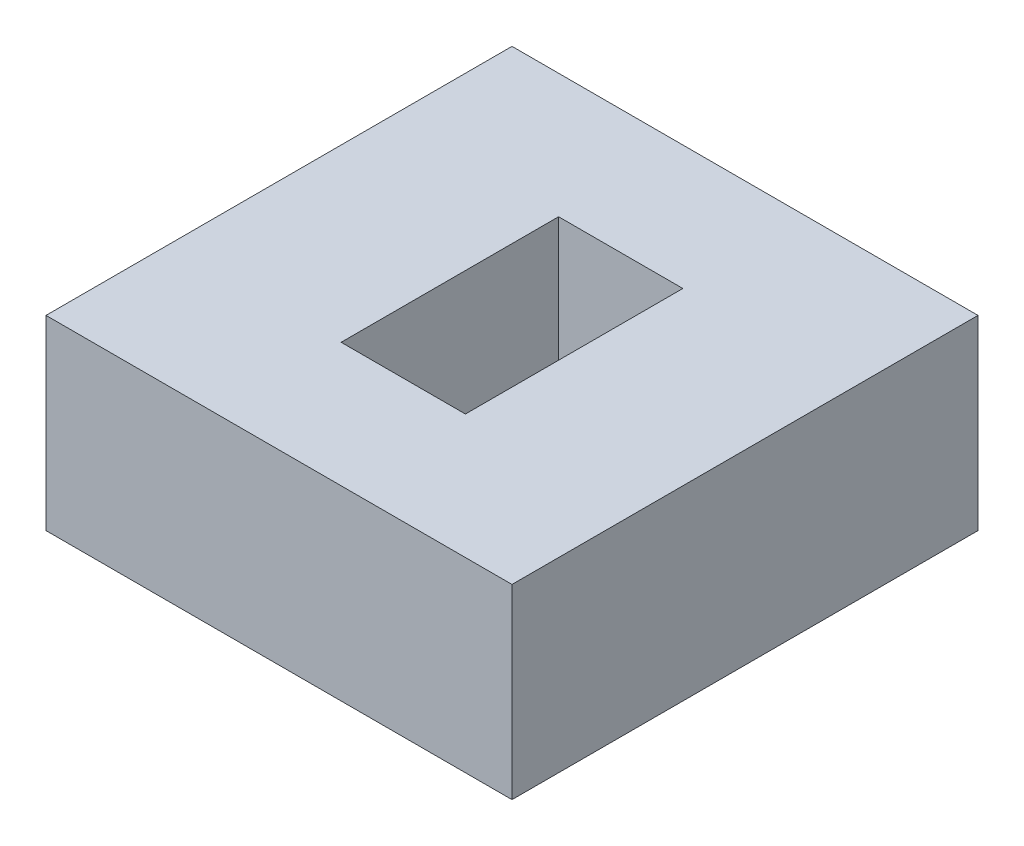
ISO-10303-21;
HEADER;
FILE_DESCRIPTION(('STEP AP214'),'2;1');
FILE_NAME('part.step','',(''),(''),'','','');
FILE_SCHEMA(('AUTOMOTIVE_DESIGN { 1 0 10303 214 1 1 1 1 }'));
ENDSEC;
DATA;
#1=APPLICATION_CONTEXT('core data for automotive mechanical design processes');
#2=APPLICATION_PROTOCOL_DEFINITION('international standard','automotive_design',2000,#1);
#3=PRODUCT_CONTEXT('',#1,'mechanical');
#4=PRODUCT('Part','Part','',(#3));
#5=PRODUCT_RELATED_PRODUCT_CATEGORY('part','',(#4));
#6=PRODUCT_DEFINITION_FORMATION('','',#4);
#7=PRODUCT_DEFINITION_CONTEXT('part definition',#1,'design');
#8=PRODUCT_DEFINITION('design','',#6,#7);
#9=PRODUCT_DEFINITION_SHAPE('','',#8);
#10=(LENGTH_UNIT() NAMED_UNIT(*) SI_UNIT(.MILLI.,.METRE.));
#11=(NAMED_UNIT(*) PLANE_ANGLE_UNIT() SI_UNIT($,.RADIAN.));
#12=(NAMED_UNIT(*) SI_UNIT($,.STERADIAN.) SOLID_ANGLE_UNIT());
#13=UNCERTAINTY_MEASURE_WITH_UNIT(LENGTH_MEASURE(1.E-05),#10,'distance_accuracy_value','');
#14=(GEOMETRIC_REPRESENTATION_CONTEXT(3) GLOBAL_UNCERTAINTY_ASSIGNED_CONTEXT((#13)) GLOBAL_UNIT_ASSIGNED_CONTEXT((#10,
#11,#12)) REPRESENTATION_CONTEXT('',''));
#15=CARTESIAN_POINT('',(0.,0.,0.));
#16=DIRECTION('',(0.,0.,1.));
#17=DIRECTION('',(1.,0.,0.));
#18=AXIS2_PLACEMENT_3D('',#15,#16,#17);
#19=CARTESIAN_POINT('',(75.,30.,0.));
#20=DIRECTION('',(0.,0.,-1.));
#21=DIRECTION('',(-1.,0.,0.));
#22=AXIS2_PLACEMENT_3D('',#19,#20,#21);
#23=PLANE('',#22);
#24=DIRECTION('',(1.,0.,0.));
#25=VECTOR('',#24,1.);
#26=CARTESIAN_POINT('',(75.,0.,0.));
#27=LINE('',#26,#25);
#28=CARTESIAN_POINT('',(0.,0.,0.));
#29=VERTEX_POINT('',#28);
#30=CARTESIAN_POINT('',(75.,0.,0.));
#31=VERTEX_POINT('',#30);
#32=EDGE_CURVE('E147',#29,#31,#27,.T.);
#33=ORIENTED_EDGE('',*,*,#32,.T.);
#34=DIRECTION('',(0.,-1.,0.));
#35=VECTOR('',#34,1.);
#36=CARTESIAN_POINT('',(75.,30.,0.));
#37=LINE('',#36,#35);
#38=CARTESIAN_POINT('',(75.,30.,0.));
#39=VERTEX_POINT('',#38);
#40=EDGE_CURVE('E11',#39,#31,#37,.T.);
#41=ORIENTED_EDGE('',*,*,#40,.F.);
#42=DIRECTION('',(1.,0.,0.));
#43=VECTOR('',#42,1.);
#44=CARTESIAN_POINT('',(75.,30.,0.));
#45=LINE('',#44,#43);
#46=CARTESIAN_POINT('',(0.,30.,0.));
#47=VERTEX_POINT('',#46);
#48=EDGE_CURVE('E153',#47,#39,#45,.T.);
#49=ORIENTED_EDGE('',*,*,#48,.F.);
#50=DIRECTION('',(0.,-1.,0.));
#51=VECTOR('',#50,1.);
#52=CARTESIAN_POINT('',(0.,30.,0.));
#53=LINE('',#52,#51);
#54=EDGE_CURVE('E167',#47,#29,#53,.T.);
#55=ORIENTED_EDGE('',*,*,#54,.T.);
#56=EDGE_LOOP('',(#33,#41,#49,#55));
#57=FACE_BOUND('',#56,.T.);
#58=ADVANCED_FACE('F39',(#57),#23,.F.);
#59=CARTESIAN_POINT('',(75.,30.,-75.));
#60=DIRECTION('',(-1.,0.,0.));
#61=DIRECTION('',(0.,0.,1.));
#62=AXIS2_PLACEMENT_3D('',#59,#60,#61);
#63=PLANE('',#62);
#64=DIRECTION('',(0.,0.,-1.));
#65=VECTOR('',#64,1.);
#66=CARTESIAN_POINT('',(75.,0.,-75.));
#67=LINE('',#66,#65);
#68=CARTESIAN_POINT('',(75.,0.,-75.));
#69=VERTEX_POINT('',#68);
#70=EDGE_CURVE('E171',#31,#69,#67,.T.);
#71=ORIENTED_EDGE('',*,*,#70,.T.);
#72=DIRECTION('',(0.,-1.,0.));
#73=VECTOR('',#72,1.);
#74=CARTESIAN_POINT('',(75.,30.,-75.));
#75=LINE('',#74,#73);
#76=CARTESIAN_POINT('',(75.,30.,-75.));
#77=VERTEX_POINT('',#76);
#78=EDGE_CURVE('E47',#77,#69,#75,.T.);
#79=ORIENTED_EDGE('',*,*,#78,.F.);
#80=DIRECTION('',(0.,0.,-1.));
#81=VECTOR('',#80,1.);
#82=CARTESIAN_POINT('',(75.,30.,-75.));
#83=LINE('',#82,#81);
#84=EDGE_CURVE('E157',#39,#77,#83,.T.);
#85=ORIENTED_EDGE('',*,*,#84,.F.);
#86=ORIENTED_EDGE('',*,*,#40,.T.);
#87=EDGE_LOOP('',(#71,#79,#85,#86));
#88=FACE_BOUND('',#87,.T.);
#89=ADVANCED_FACE('F205',(#88),#63,.F.);
#90=CARTESIAN_POINT('',(0.,30.,-75.));
#91=DIRECTION('',(0.,0.,1.));
#92=DIRECTION('',(1.,0.,0.));
#93=AXIS2_PLACEMENT_3D('',#90,#91,#92);
#94=PLANE('',#93);
#95=DIRECTION('',(-1.,0.,0.));
#96=VECTOR('',#95,1.);
#97=CARTESIAN_POINT('',(0.,0.,-75.));
#98=LINE('',#97,#96);
#99=CARTESIAN_POINT('',(0.,0.,-75.));
#100=VERTEX_POINT('',#99);
#101=EDGE_CURVE('E174',#69,#100,#98,.T.);
#102=ORIENTED_EDGE('',*,*,#101,.T.);
#103=DIRECTION('',(0.,-1.,0.));
#104=VECTOR('',#103,1.);
#105=CARTESIAN_POINT('',(0.,30.,-75.));
#106=LINE('',#105,#104);
#107=CARTESIAN_POINT('',(0.,30.,-75.));
#108=VERTEX_POINT('',#107);
#109=EDGE_CURVE('E182',#108,#100,#106,.T.);
#110=ORIENTED_EDGE('',*,*,#109,.F.);
#111=DIRECTION('',(-1.,0.,0.));
#112=VECTOR('',#111,1.);
#113=CARTESIAN_POINT('',(0.,30.,-75.));
#114=LINE('',#113,#112);
#115=EDGE_CURVE('E161',#77,#108,#114,.T.);
#116=ORIENTED_EDGE('',*,*,#115,.F.);
#117=ORIENTED_EDGE('',*,*,#78,.T.);
#118=EDGE_LOOP('',(#102,#110,#116,#117));
#119=FACE_BOUND('',#118,.T.);
#120=ADVANCED_FACE('F191',(#119),#94,.F.);
#121=CARTESIAN_POINT('',(0.,30.,0.));
#122=DIRECTION('',(1.,0.,0.));
#123=DIRECTION('',(0.,0.,-1.));
#124=AXIS2_PLACEMENT_3D('',#121,#122,#123);
#125=PLANE('',#124);
#126=DIRECTION('',(0.,0.,1.));
#127=VECTOR('',#126,1.);
#128=CARTESIAN_POINT('',(0.,0.,0.));
#129=LINE('',#128,#127);
#130=EDGE_CURVE('E158',#100,#29,#129,.T.);
#131=ORIENTED_EDGE('',*,*,#130,.T.);
#132=ORIENTED_EDGE('',*,*,#54,.F.);
#133=DIRECTION('',(0.,0.,1.));
#134=VECTOR('',#133,1.);
#135=CARTESIAN_POINT('',(0.,30.,0.));
#136=LINE('',#135,#134);
#137=EDGE_CURVE('E164',#108,#47,#136,.T.);
#138=ORIENTED_EDGE('',*,*,#137,.F.);
#139=ORIENTED_EDGE('',*,*,#109,.T.);
#140=EDGE_LOOP('',(#131,#132,#138,#139));
#141=FACE_BOUND('',#140,.T.);
#142=ADVANCED_FACE('F198',(#141),#125,.F.);
#143=CARTESIAN_POINT('',(0.,30.,0.));
#144=DIRECTION('',(0.,-1.,0.));
#145=DIRECTION('',(0.,0.,-1.));
#146=AXIS2_PLACEMENT_3D('',#143,#144,#145);
#147=PLANE('',#146);
#148=DIRECTION('',(0.,0.,-1.));
#149=VECTOR('',#148,1.);
#150=CARTESIAN_POINT('',(47.5,30.,-55.));
#151=LINE('',#150,#149);
#152=CARTESIAN_POINT('',(47.5,30.,-20.));
#153=VERTEX_POINT('',#152);
#154=CARTESIAN_POINT('',(47.5,30.,-55.));
#155=VERTEX_POINT('',#154);
#156=EDGE_CURVE('E138',#153,#155,#151,.T.);
#157=ORIENTED_EDGE('',*,*,#156,.F.);
#158=DIRECTION('',(1.,0.,0.));
#159=VECTOR('',#158,1.);
#160=CARTESIAN_POINT('',(47.5,30.,-20.));
#161=LINE('',#160,#159);
#162=CARTESIAN_POINT('',(27.5,30.,-20.));
#163=VERTEX_POINT('',#162);
#164=EDGE_CURVE('E54',#163,#153,#161,.T.);
#165=ORIENTED_EDGE('',*,*,#164,.F.);
#166=DIRECTION('',(0.,0.,1.));
#167=VECTOR('',#166,1.);
#168=CARTESIAN_POINT('',(27.5,30.,-20.));
#169=LINE('',#168,#167);
#170=CARTESIAN_POINT('',(27.5,30.,-55.));
#171=VERTEX_POINT('',#170);
#172=EDGE_CURVE('E125',#171,#163,#169,.T.);
#173=ORIENTED_EDGE('',*,*,#172,.F.);
#174=DIRECTION('',(-1.,0.,0.));
#175=VECTOR('',#174,1.);
#176=CARTESIAN_POINT('',(27.5,30.,-55.));
#177=LINE('',#176,#175);
#178=EDGE_CURVE('E129',#155,#171,#177,.T.);
#179=ORIENTED_EDGE('',*,*,#178,.F.);
#180=EDGE_LOOP('',(#157,#165,#173,#179));
#181=FACE_BOUND('',#180,.T.);
#182=ORIENTED_EDGE('',*,*,#48,.T.);
#183=ORIENTED_EDGE('',*,*,#84,.T.);
#184=ORIENTED_EDGE('',*,*,#115,.T.);
#185=ORIENTED_EDGE('',*,*,#137,.T.);
#186=EDGE_LOOP('',(#182,#183,#184,#185));
#187=FACE_BOUND('',#186,.T.);
#188=ADVANCED_FACE('F204',(#181,#187),#147,.F.);
#189=CARTESIAN_POINT('',(0.,0.,0.));
#190=DIRECTION('',(0.,-1.,0.));
#191=DIRECTION('',(0.,0.,-1.));
#192=AXIS2_PLACEMENT_3D('',#189,#190,#191);
#193=PLANE('',#192);
#194=DIRECTION('',(1.,0.,0.));
#195=VECTOR('',#194,1.);
#196=CARTESIAN_POINT('',(47.5,0.,-20.));
#197=LINE('',#196,#195);
#198=CARTESIAN_POINT('',(27.5,0.,-20.));
#199=VERTEX_POINT('',#198);
#200=CARTESIAN_POINT('',(47.5,0.,-20.));
#201=VERTEX_POINT('',#200);
#202=EDGE_CURVE('E106',#199,#201,#197,.T.);
#203=ORIENTED_EDGE('',*,*,#202,.T.);
#204=DIRECTION('',(0.,0.,-1.));
#205=VECTOR('',#204,1.);
#206=CARTESIAN_POINT('',(47.5,0.,-55.));
#207=LINE('',#206,#205);
#208=CARTESIAN_POINT('',(47.5,0.,-55.));
#209=VERTEX_POINT('',#208);
#210=EDGE_CURVE('E116',#201,#209,#207,.T.);
#211=ORIENTED_EDGE('',*,*,#210,.T.);
#212=DIRECTION('',(-1.,0.,0.));
#213=VECTOR('',#212,1.);
#214=CARTESIAN_POINT('',(27.5,0.,-55.));
#215=LINE('',#214,#213);
#216=CARTESIAN_POINT('',(27.5,0.,-55.));
#217=VERTEX_POINT('',#216);
#218=EDGE_CURVE('E62',#209,#217,#215,.T.);
#219=ORIENTED_EDGE('',*,*,#218,.T.);
#220=DIRECTION('',(0.,0.,1.));
#221=VECTOR('',#220,1.);
#222=CARTESIAN_POINT('',(27.5,0.,-20.));
#223=LINE('',#222,#221);
#224=EDGE_CURVE('E113',#217,#199,#223,.T.);
#225=ORIENTED_EDGE('',*,*,#224,.T.);
#226=EDGE_LOOP('',(#203,#211,#219,#225));
#227=FACE_BOUND('',#226,.T.);
#228=ORIENTED_EDGE('',*,*,#32,.F.);
#229=ORIENTED_EDGE('',*,*,#130,.F.);
#230=ORIENTED_EDGE('',*,*,#101,.F.);
#231=ORIENTED_EDGE('',*,*,#70,.F.);
#232=EDGE_LOOP('',(#228,#229,#230,#231));
#233=FACE_BOUND('',#232,.T.);
#234=ADVANCED_FACE('F121',(#227,#233),#193,.T.);
#235=CARTESIAN_POINT('',(47.5,0.,-20.));
#236=DIRECTION('',(0.,0.,1.));
#237=DIRECTION('',(1.,0.,0.));
#238=AXIS2_PLACEMENT_3D('',#235,#236,#237);
#239=PLANE('',#238);
#240=ORIENTED_EDGE('',*,*,#164,.T.);
#241=DIRECTION('',(0.,1.,0.));
#242=VECTOR('',#241,1.);
#243=CARTESIAN_POINT('',(47.5,0.,-20.));
#244=LINE('',#243,#242);
#245=EDGE_CURVE('E102',#201,#153,#244,.T.);
#246=ORIENTED_EDGE('',*,*,#245,.F.);
#247=ORIENTED_EDGE('',*,*,#202,.F.);
#248=DIRECTION('',(0.,1.,0.));
#249=VECTOR('',#248,1.);
#250=CARTESIAN_POINT('',(27.5,0.,-20.));
#251=LINE('',#250,#249);
#252=EDGE_CURVE('E144',#199,#163,#251,.T.);
#253=ORIENTED_EDGE('',*,*,#252,.T.);
#254=EDGE_LOOP('',(#240,#246,#247,#253));
#255=FACE_BOUND('',#254,.T.);
#256=ADVANCED_FACE('F104',(#255),#239,.F.);
#257=CARTESIAN_POINT('',(27.5,0.,-20.));
#258=DIRECTION('',(-1.,0.,0.));
#259=DIRECTION('',(0.,0.,1.));
#260=AXIS2_PLACEMENT_3D('',#257,#258,#259);
#261=PLANE('',#260);
#262=ORIENTED_EDGE('',*,*,#172,.T.);
#263=ORIENTED_EDGE('',*,*,#252,.F.);
#264=ORIENTED_EDGE('',*,*,#224,.F.);
#265=DIRECTION('',(0.,1.,0.));
#266=VECTOR('',#265,1.);
#267=CARTESIAN_POINT('',(27.5,0.,-55.));
#268=LINE('',#267,#266);
#269=EDGE_CURVE('E148',#217,#171,#268,.T.);
#270=ORIENTED_EDGE('',*,*,#269,.T.);
#271=EDGE_LOOP('',(#262,#263,#264,#270));
#272=FACE_BOUND('',#271,.T.);
#273=ADVANCED_FACE('F222',(#272),#261,.F.);
#274=CARTESIAN_POINT('',(27.5,0.,-55.));
#275=DIRECTION('',(0.,0.,-1.));
#276=DIRECTION('',(-1.,0.,0.));
#277=AXIS2_PLACEMENT_3D('',#274,#275,#276);
#278=PLANE('',#277);
#279=ORIENTED_EDGE('',*,*,#178,.T.);
#280=ORIENTED_EDGE('',*,*,#269,.F.);
#281=ORIENTED_EDGE('',*,*,#218,.F.);
#282=DIRECTION('',(0.,1.,0.));
#283=VECTOR('',#282,1.);
#284=CARTESIAN_POINT('',(47.5,0.,-55.));
#285=LINE('',#284,#283);
#286=EDGE_CURVE('E112',#209,#155,#285,.T.);
#287=ORIENTED_EDGE('',*,*,#286,.T.);
#288=EDGE_LOOP('',(#279,#280,#281,#287));
#289=FACE_BOUND('',#288,.T.);
#290=ADVANCED_FACE('F225',(#289),#278,.F.);
#291=CARTESIAN_POINT('',(47.5,0.,-55.));
#292=DIRECTION('',(1.,0.,0.));
#293=DIRECTION('',(0.,0.,-1.));
#294=AXIS2_PLACEMENT_3D('',#291,#292,#293);
#295=PLANE('',#294);
#296=ORIENTED_EDGE('',*,*,#156,.T.);
#297=ORIENTED_EDGE('',*,*,#286,.F.);
#298=ORIENTED_EDGE('',*,*,#210,.F.);
#299=ORIENTED_EDGE('',*,*,#245,.T.);
#300=EDGE_LOOP('',(#296,#297,#298,#299));
#301=FACE_BOUND('',#300,.T.);
#302=ADVANCED_FACE('F117',(#301),#295,.F.);
#303=CLOSED_SHELL('',(#58,#89,#120,#142,#188,#234,#256,#273,#290,#302));
#304=MANIFOLD_SOLID_BREP('B2',#303);
#305=ADVANCED_BREP_SHAPE_REPRESENTATION('',(#18,#304),#14);
#306=SHAPE_DEFINITION_REPRESENTATION(#9,#305);
ENDSEC;
END-ISO-10303-21;
